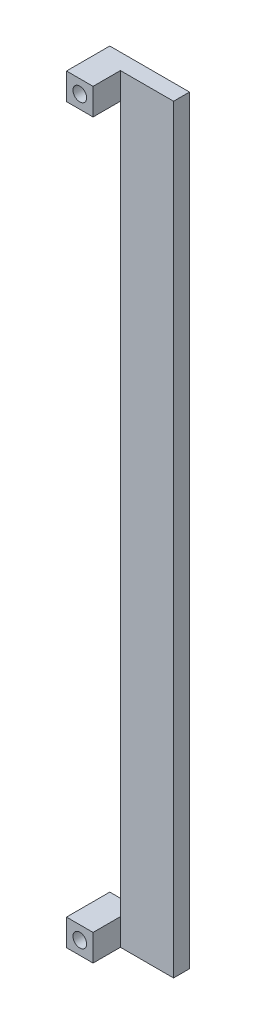
ISO-10303-21;
HEADER;
FILE_DESCRIPTION(('STEP AP214'),'2;1');
FILE_NAME('part.step','',(''),(''),'','','');
FILE_SCHEMA(('AUTOMOTIVE_DESIGN { 1 0 10303 214 1 1 1 1 }'));
ENDSEC;
DATA;
#1=APPLICATION_CONTEXT('core data for automotive mechanical design processes');
#2=APPLICATION_PROTOCOL_DEFINITION('international standard','automotive_design',2000,#1);
#3=PRODUCT_CONTEXT('',#1,'mechanical');
#4=PRODUCT('Part','Part','',(#3));
#5=PRODUCT_RELATED_PRODUCT_CATEGORY('part','',(#4));
#6=PRODUCT_DEFINITION_FORMATION('','',#4);
#7=PRODUCT_DEFINITION_CONTEXT('part definition',#1,'design');
#8=PRODUCT_DEFINITION('design','',#6,#7);
#9=PRODUCT_DEFINITION_SHAPE('','',#8);
#10=(LENGTH_UNIT() NAMED_UNIT(*) SI_UNIT(.MILLI.,.METRE.));
#11=(NAMED_UNIT(*) PLANE_ANGLE_UNIT() SI_UNIT($,.RADIAN.));
#12=(NAMED_UNIT(*) SI_UNIT($,.STERADIAN.) SOLID_ANGLE_UNIT());
#13=UNCERTAINTY_MEASURE_WITH_UNIT(LENGTH_MEASURE(1.E-05),#10,'distance_accuracy_value','');
#14=(GEOMETRIC_REPRESENTATION_CONTEXT(3) GLOBAL_UNCERTAINTY_ASSIGNED_CONTEXT((#13)) GLOBAL_UNIT_ASSIGNED_CONTEXT((#10,
#11,#12)) REPRESENTATION_CONTEXT('',''));
#15=CARTESIAN_POINT('',(0.,0.,0.));
#16=DIRECTION('',(0.,0.,1.));
#17=DIRECTION('',(1.,0.,0.));
#18=AXIS2_PLACEMENT_3D('',#15,#16,#17);
#19=CARTESIAN_POINT('',(-6.70317924025839,-12.1275190553962,4.2));
#20=DIRECTION('',(1.,0.,0.));
#21=DIRECTION('',(0.,0.,-1.));
#22=AXIS2_PLACEMENT_3D('',#19,#20,#21);
#23=PLANE('',#22);
#24=DIRECTION('',(0.,0.,-1.));
#25=VECTOR('',#24,1.);
#26=CARTESIAN_POINT('',(-6.70317924025839,180.872480944604,11.4));
#27=LINE('',#26,#25);
#28=CARTESIAN_POINT('',(-6.70317924025839,180.872480944604,4.2));
#29=VERTEX_POINT('',#28);
#30=CARTESIAN_POINT('',(-6.70317924025839,180.872480944604,0.));
#31=VERTEX_POINT('',#30);
#32=EDGE_CURVE('E215',#29,#31,#27,.T.);
#33=ORIENTED_EDGE('',*,*,#32,.T.);
#34=DIRECTION('',(0.,-1.,0.));
#35=VECTOR('',#34,1.);
#36=CARTESIAN_POINT('',(-6.70317924025839,-12.1275190553962,0.));
#37=LINE('',#36,#35);
#38=CARTESIAN_POINT('',(-6.70317924025839,-5.12751905539625,0.));
#39=VERTEX_POINT('',#38);
#40=EDGE_CURVE('E176',#31,#39,#37,.T.);
#41=ORIENTED_EDGE('',*,*,#40,.T.);
#42=DIRECTION('',(0.,0.,-1.));
#43=VECTOR('',#42,1.);
#44=CARTESIAN_POINT('',(-6.70317924025839,-5.12751905539625,11.4));
#45=LINE('',#44,#43);
#46=CARTESIAN_POINT('',(-6.70317924025839,-5.12751905539625,4.2));
#47=VERTEX_POINT('',#46);
#48=EDGE_CURVE('E11',#47,#39,#45,.T.);
#49=ORIENTED_EDGE('',*,*,#48,.F.);
#50=DIRECTION('',(0.,-1.,0.));
#51=VECTOR('',#50,1.);
#52=CARTESIAN_POINT('',(-6.70317924025839,-12.1275190553962,4.2));
#53=LINE('',#52,#51);
#54=EDGE_CURVE('E49',#29,#47,#53,.T.);
#55=ORIENTED_EDGE('',*,*,#54,.F.);
#56=EDGE_LOOP('',(#33,#41,#49,#55));
#57=FACE_BOUND('',#56,.T.);
#58=ADVANCED_FACE('F33',(#57),#23,.F.);
#59=CARTESIAN_POINT('',(7.29682075974161,-12.1275190553962,4.2));
#60=DIRECTION('',(0.,1.,0.));
#61=DIRECTION('',(0.,0.,1.));
#62=AXIS2_PLACEMENT_3D('',#59,#60,#61);
#63=PLANE('',#62);
#64=DIRECTION('',(1.,0.,0.));
#65=VECTOR('',#64,1.);
#66=CARTESIAN_POINT('',(7.29682075974161,-12.1275190553962,0.));
#67=LINE('',#66,#65);
#68=CARTESIAN_POINT('',(-13.7031792402584,-12.1275190553962,0.));
#69=VERTEX_POINT('',#68);
#70=CARTESIAN_POINT('',(7.29682075974161,-12.1275190553962,0.));
#71=VERTEX_POINT('',#70);
#72=EDGE_CURVE('E187',#69,#71,#67,.T.);
#73=ORIENTED_EDGE('',*,*,#72,.T.);
#74=DIRECTION('',(0.,0.,-1.));
#75=VECTOR('',#74,1.);
#76=CARTESIAN_POINT('',(7.29682075974161,-12.1275190553962,4.2));
#77=LINE('',#76,#75);
#78=CARTESIAN_POINT('',(7.29682075974161,-12.1275190553962,4.2));
#79=VERTEX_POINT('',#78);
#80=EDGE_CURVE('E36',#79,#71,#77,.T.);
#81=ORIENTED_EDGE('',*,*,#80,.F.);
#82=DIRECTION('',(1.,0.,0.));
#83=VECTOR('',#82,1.);
#84=CARTESIAN_POINT('',(7.29682075974161,-12.1275190553962,4.2));
#85=LINE('',#84,#83);
#86=CARTESIAN_POINT('',(-6.70317924025839,-12.1275190553962,4.2));
#87=VERTEX_POINT('',#86);
#88=EDGE_CURVE('E178',#87,#79,#85,.T.);
#89=ORIENTED_EDGE('',*,*,#88,.F.);
#90=DIRECTION('',(0.,0.,-1.));
#91=VECTOR('',#90,1.);
#92=CARTESIAN_POINT('',(-6.70317924025839,-12.1275190553962,11.4));
#93=LINE('',#92,#91);
#94=CARTESIAN_POINT('',(-6.70317924025839,-12.1275190553962,11.4));
#95=VERTEX_POINT('',#94);
#96=EDGE_CURVE('E163',#95,#87,#93,.T.);
#97=ORIENTED_EDGE('',*,*,#96,.F.);
#98=DIRECTION('',(1.,0.,0.));
#99=VECTOR('',#98,1.);
#100=CARTESIAN_POINT('',(-6.70317924025839,-12.1275190553962,11.4));
#101=LINE('',#100,#99);
#102=CARTESIAN_POINT('',(-13.7031792402584,-12.1275190553962,11.4));
#103=VERTEX_POINT('',#102);
#104=EDGE_CURVE('E161',#103,#95,#101,.T.);
#105=ORIENTED_EDGE('',*,*,#104,.F.);
#106=DIRECTION('',(0.,0.,-1.));
#107=VECTOR('',#106,1.);
#108=CARTESIAN_POINT('',(-13.7031792402584,-12.1275190553962,11.4));
#109=LINE('',#108,#107);
#110=EDGE_CURVE('E169',#103,#69,#109,.T.);
#111=ORIENTED_EDGE('',*,*,#110,.T.);
#112=EDGE_LOOP('',(#73,#81,#89,#97,#105,#111));
#113=FACE_BOUND('',#112,.T.);
#114=ADVANCED_FACE('F228',(#113),#63,.F.);
#115=CARTESIAN_POINT('',(7.29682075974159,187.872480944604,4.2));
#116=DIRECTION('',(-1.,0.,0.));
#117=DIRECTION('',(0.,-1.,0.));
#118=AXIS2_PLACEMENT_3D('',#115,#116,#117);
#119=PLANE('',#118);
#120=DIRECTION('',(0.,1.,0.));
#121=VECTOR('',#120,1.);
#122=CARTESIAN_POINT('',(7.29682075974159,187.872480944604,0.));
#123=LINE('',#122,#121);
#124=CARTESIAN_POINT('',(7.29682075974159,187.872480944604,0.));
#125=VERTEX_POINT('',#124);
#126=EDGE_CURVE('E189',#71,#125,#123,.T.);
#127=ORIENTED_EDGE('',*,*,#126,.T.);
#128=DIRECTION('',(0.,0.,-1.));
#129=VECTOR('',#128,1.);
#130=CARTESIAN_POINT('',(7.29682075974159,187.872480944604,4.2));
#131=LINE('',#130,#129);
#132=CARTESIAN_POINT('',(7.29682075974159,187.872480944604,4.2));
#133=VERTEX_POINT('',#132);
#134=EDGE_CURVE('E185',#133,#125,#131,.T.);
#135=ORIENTED_EDGE('',*,*,#134,.F.);
#136=DIRECTION('',(0.,1.,0.));
#137=VECTOR('',#136,1.);
#138=CARTESIAN_POINT('',(7.29682075974159,187.872480944604,4.2));
#139=LINE('',#138,#137);
#140=EDGE_CURVE('E181',#79,#133,#139,.T.);
#141=ORIENTED_EDGE('',*,*,#140,.F.);
#142=ORIENTED_EDGE('',*,*,#80,.T.);
#143=EDGE_LOOP('',(#127,#135,#141,#142));
#144=FACE_BOUND('',#143,.T.);
#145=ADVANCED_FACE('F200',(#144),#119,.F.);
#146=CARTESIAN_POINT('',(-6.70317924025839,187.872480944604,4.2));
#147=DIRECTION('',(0.,-1.,0.));
#148=DIRECTION('',(0.,0.,-1.));
#149=AXIS2_PLACEMENT_3D('',#146,#147,#148);
#150=PLANE('',#149);
#151=DIRECTION('',(-1.,0.,0.));
#152=VECTOR('',#151,1.);
#153=CARTESIAN_POINT('',(-6.70317924025839,187.872480944604,0.));
#154=LINE('',#153,#152);
#155=CARTESIAN_POINT('',(-13.7031792402584,187.872480944604,0.));
#156=VERTEX_POINT('',#155);
#157=EDGE_CURVE('E191',#125,#156,#154,.T.);
#158=ORIENTED_EDGE('',*,*,#157,.T.);
#159=DIRECTION('',(0.,0.,-1.));
#160=VECTOR('',#159,1.);
#161=CARTESIAN_POINT('',(-13.7031792402584,187.872480944604,11.4));
#162=LINE('',#161,#160);
#163=CARTESIAN_POINT('',(-13.7031792402584,187.872480944604,11.4));
#164=VERTEX_POINT('',#163);
#165=EDGE_CURVE('E122',#164,#156,#162,.T.);
#166=ORIENTED_EDGE('',*,*,#165,.F.);
#167=DIRECTION('',(-1.,0.,0.));
#168=VECTOR('',#167,1.);
#169=CARTESIAN_POINT('',(-6.70317924025839,187.872480944604,11.4));
#170=LINE('',#169,#168);
#171=CARTESIAN_POINT('',(-6.70317924025839,187.872480944604,11.4));
#172=VERTEX_POINT('',#171);
#173=EDGE_CURVE('E115',#172,#164,#170,.T.);
#174=ORIENTED_EDGE('',*,*,#173,.F.);
#175=DIRECTION('',(0.,0.,-1.));
#176=VECTOR('',#175,1.);
#177=CARTESIAN_POINT('',(-6.70317924025839,187.872480944604,11.4));
#178=LINE('',#177,#176);
#179=CARTESIAN_POINT('',(-6.70317924025839,187.872480944604,4.2));
#180=VERTEX_POINT('',#179);
#181=EDGE_CURVE('E120',#172,#180,#178,.T.);
#182=ORIENTED_EDGE('',*,*,#181,.T.);
#183=DIRECTION('',(-1.,0.,0.));
#184=VECTOR('',#183,1.);
#185=CARTESIAN_POINT('',(-6.70317924025839,187.872480944604,4.2));
#186=LINE('',#185,#184);
#187=EDGE_CURVE('E183',#133,#180,#186,.T.);
#188=ORIENTED_EDGE('',*,*,#187,.F.);
#189=ORIENTED_EDGE('',*,*,#134,.T.);
#190=EDGE_LOOP('',(#158,#166,#174,#182,#188,#189));
#191=FACE_BOUND('',#190,.T.);
#192=ADVANCED_FACE('F117',(#191),#150,.F.);
#193=CARTESIAN_POINT('',(0.,0.,4.2));
#194=DIRECTION('',(0.,0.,-1.));
#195=DIRECTION('',(-1.,0.,0.));
#196=AXIS2_PLACEMENT_3D('',#193,#194,#195);
#197=PLANE('',#196);
#198=EDGE_CURVE('E140',#180,#29,#53,.T.);
#199=ORIENTED_EDGE('',*,*,#198,.T.);
#200=ORIENTED_EDGE('',*,*,#54,.T.);
#201=EDGE_CURVE('E179',#47,#87,#53,.T.);
#202=ORIENTED_EDGE('',*,*,#201,.T.);
#203=ORIENTED_EDGE('',*,*,#88,.T.);
#204=ORIENTED_EDGE('',*,*,#140,.T.);
#205=ORIENTED_EDGE('',*,*,#187,.T.);
#206=EDGE_LOOP('',(#199,#200,#202,#203,#204,#205));
#207=FACE_BOUND('',#206,.T.);
#208=ADVANCED_FACE('F239',(#207),#197,.F.);
#209=CARTESIAN_POINT('',(0.,0.,0.));
#210=DIRECTION('',(0.,0.,-1.));
#211=DIRECTION('',(-1.,0.,0.));
#212=AXIS2_PLACEMENT_3D('',#209,#210,#211);
#213=PLANE('',#212);
#214=ORIENTED_EDGE('',*,*,#40,.F.);
#215=DIRECTION('',(1.,0.,0.));
#216=VECTOR('',#215,1.);
#217=CARTESIAN_POINT('',(-6.70317924025839,180.872480944604,0.));
#218=LINE('',#217,#216);
#219=CARTESIAN_POINT('',(-13.7031792402584,180.872480944604,0.));
#220=VERTEX_POINT('',#219);
#221=EDGE_CURVE('E136',#220,#31,#218,.T.);
#222=ORIENTED_EDGE('',*,*,#221,.F.);
#223=DIRECTION('',(0.,-1.,0.));
#224=VECTOR('',#223,1.);
#225=CARTESIAN_POINT('',(-13.7031792402584,187.872480944604,0.));
#226=LINE('',#225,#224);
#227=EDGE_CURVE('E209',#156,#220,#226,.T.);
#228=ORIENTED_EDGE('',*,*,#227,.F.);
#229=ORIENTED_EDGE('',*,*,#157,.F.);
#230=ORIENTED_EDGE('',*,*,#126,.F.);
#231=ORIENTED_EDGE('',*,*,#72,.F.);
#232=DIRECTION('',(0.,-1.,0.));
#233=VECTOR('',#232,1.);
#234=CARTESIAN_POINT('',(-13.7031792402584,-12.1275190553962,0.));
#235=LINE('',#234,#233);
#236=CARTESIAN_POINT('',(-13.7031792402584,-5.12751905539625,0.));
#237=VERTEX_POINT('',#236);
#238=EDGE_CURVE('E157',#237,#69,#235,.T.);
#239=ORIENTED_EDGE('',*,*,#238,.F.);
#240=DIRECTION('',(-1.,0.,0.));
#241=VECTOR('',#240,1.);
#242=CARTESIAN_POINT('',(-6.70317924025839,-5.12751905539625,0.));
#243=LINE('',#242,#241);
#244=EDGE_CURVE('E151',#39,#237,#243,.T.);
#245=ORIENTED_EDGE('',*,*,#244,.F.);
#246=EDGE_LOOP('',(#214,#222,#228,#229,#230,#231,#239,#245));
#247=FACE_BOUND('',#246,.T.);
#248=CARTESIAN_POINT('',(-10.2031792402584,-8.62751905539625,0.));
#249=DIRECTION('',(0.,0.,1.));
#250=DIRECTION('',(1.,0.,0.));
#251=AXIS2_PLACEMENT_3D('',#248,#249,#250);
#252=CIRCLE('',#251,1.8);
#253=CARTESIAN_POINT('',(-8.40317924025839,-8.62751905539625,0.));
#254=VERTEX_POINT('',#253);
#255=EDGE_CURVE('E141',#254,#254,#252,.T.);
#256=ORIENTED_EDGE('',*,*,#255,.T.);
#257=EDGE_LOOP('',(#256));
#258=FACE_BOUND('',#257,.T.);
#259=CARTESIAN_POINT('',(-10.2031792402584,184.372480944604,0.));
#260=DIRECTION('',(0.,0.,1.));
#261=DIRECTION('',(1.,0.,0.));
#262=AXIS2_PLACEMENT_3D('',#259,#260,#261);
#263=CIRCLE('',#262,1.8);
#264=CARTESIAN_POINT('',(-8.40317924025839,184.372480944604,0.));
#265=VERTEX_POINT('',#264);
#266=EDGE_CURVE('E282',#265,#265,#263,.T.);
#267=ORIENTED_EDGE('',*,*,#266,.T.);
#268=EDGE_LOOP('',(#267));
#269=FACE_BOUND('',#268,.T.);
#270=ADVANCED_FACE('F204',(#247,#258,#269),#213,.T.);
#271=CARTESIAN_POINT('',(0.,0.,11.4));
#272=DIRECTION('',(0.,0.,1.));
#273=DIRECTION('',(1.,0.,0.));
#274=AXIS2_PLACEMENT_3D('',#271,#272,#273);
#275=PLANE('',#274);
#276=DIRECTION('',(0.,1.,0.));
#277=VECTOR('',#276,1.);
#278=CARTESIAN_POINT('',(-6.70317924025839,-12.1275190553962,11.4));
#279=LINE('',#278,#277);
#280=CARTESIAN_POINT('',(-6.70317924025839,-5.12751905539625,11.4));
#281=VERTEX_POINT('',#280);
#282=EDGE_CURVE('E153',#95,#281,#279,.T.);
#283=ORIENTED_EDGE('',*,*,#282,.T.);
#284=DIRECTION('',(-1.,0.,0.));
#285=VECTOR('',#284,1.);
#286=CARTESIAN_POINT('',(-6.70317924025839,-5.12751905539625,11.4));
#287=LINE('',#286,#285);
#288=CARTESIAN_POINT('',(-13.7031792402584,-5.12751905539625,11.4));
#289=VERTEX_POINT('',#288);
#290=EDGE_CURVE('E156',#281,#289,#287,.T.);
#291=ORIENTED_EDGE('',*,*,#290,.T.);
#292=DIRECTION('',(0.,-1.,0.));
#293=VECTOR('',#292,1.);
#294=CARTESIAN_POINT('',(-13.7031792402584,-12.1275190553962,11.4));
#295=LINE('',#294,#293);
#296=EDGE_CURVE('E159',#289,#103,#295,.T.);
#297=ORIENTED_EDGE('',*,*,#296,.T.);
#298=ORIENTED_EDGE('',*,*,#104,.T.);
#299=EDGE_LOOP('',(#283,#291,#297,#298));
#300=FACE_BOUND('',#299,.T.);
#301=CARTESIAN_POINT('',(-10.2031792402584,-8.62751905539625,11.4));
#302=DIRECTION('',(0.,0.,1.));
#303=DIRECTION('',(1.,0.,0.));
#304=AXIS2_PLACEMENT_3D('',#301,#302,#303);
#305=CIRCLE('',#304,1.8);
#306=CARTESIAN_POINT('',(-8.40317924025839,-8.62751905539625,11.4));
#307=VERTEX_POINT('',#306);
#308=EDGE_CURVE('E144',#307,#307,#305,.T.);
#309=ORIENTED_EDGE('',*,*,#308,.F.);
#310=EDGE_LOOP('',(#309));
#311=FACE_BOUND('',#310,.T.);
#312=ADVANCED_FACE('F242',(#300,#311),#275,.T.);
#313=CARTESIAN_POINT('',(-6.70317924025839,-12.1275190553962,11.4));
#314=DIRECTION('',(-1.,0.,0.));
#315=DIRECTION('',(0.,0.,1.));
#316=AXIS2_PLACEMENT_3D('',#313,#314,#315);
#317=PLANE('',#316);
#318=ORIENTED_EDGE('',*,*,#201,.F.);
#319=EDGE_CURVE('E42',#281,#47,#45,.T.);
#320=ORIENTED_EDGE('',*,*,#319,.F.);
#321=ORIENTED_EDGE('',*,*,#282,.F.);
#322=ORIENTED_EDGE('',*,*,#96,.T.);
#323=EDGE_LOOP('',(#318,#320,#321,#322));
#324=FACE_BOUND('',#323,.T.);
#325=ADVANCED_FACE('F245',(#324),#317,.F.);
#326=CARTESIAN_POINT('',(-6.70317924025839,-5.12751905539625,11.4));
#327=DIRECTION('',(0.,-1.,0.));
#328=DIRECTION('',(1.,0.,0.));
#329=AXIS2_PLACEMENT_3D('',#326,#327,#328);
#330=PLANE('',#329);
#331=ORIENTED_EDGE('',*,*,#244,.T.);
#332=DIRECTION('',(0.,0.,-1.));
#333=VECTOR('',#332,1.);
#334=CARTESIAN_POINT('',(-13.7031792402584,-5.12751905539625,11.4));
#335=LINE('',#334,#333);
#336=EDGE_CURVE('E172',#289,#237,#335,.T.);
#337=ORIENTED_EDGE('',*,*,#336,.F.);
#338=ORIENTED_EDGE('',*,*,#290,.F.);
#339=ORIENTED_EDGE('',*,*,#319,.T.);
#340=ORIENTED_EDGE('',*,*,#48,.T.);
#341=EDGE_LOOP('',(#331,#337,#338,#339,#340));
#342=FACE_BOUND('',#341,.T.);
#343=ADVANCED_FACE('F248',(#342),#330,.F.);
#344=CARTESIAN_POINT('',(-13.7031792402584,-12.1275190553962,11.4));
#345=DIRECTION('',(1.,0.,0.));
#346=DIRECTION('',(0.,0.,-1.));
#347=AXIS2_PLACEMENT_3D('',#344,#345,#346);
#348=PLANE('',#347);
#349=ORIENTED_EDGE('',*,*,#238,.T.);
#350=ORIENTED_EDGE('',*,*,#110,.F.);
#351=ORIENTED_EDGE('',*,*,#296,.F.);
#352=ORIENTED_EDGE('',*,*,#336,.T.);
#353=EDGE_LOOP('',(#349,#350,#351,#352));
#354=FACE_BOUND('',#353,.T.);
#355=ADVANCED_FACE('F252',(#354),#348,.F.);
#356=CARTESIAN_POINT('',(-10.2031792402584,-8.62751905539625,11.4));
#357=DIRECTION('',(0.,0.,-1.));
#358=DIRECTION('',(-1.,0.,0.));
#359=AXIS2_PLACEMENT_3D('',#356,#357,#358);
#360=CYLINDRICAL_SURFACE('',#359,1.8);
#361=ORIENTED_EDGE('',*,*,#308,.T.);
#362=EDGE_LOOP('',(#361));
#363=FACE_BOUND('',#362,.T.);
#364=ORIENTED_EDGE('',*,*,#255,.F.);
#365=EDGE_LOOP('',(#364));
#366=FACE_BOUND('',#365,.T.);
#367=ADVANCED_FACE('F256',(#363,#366),#360,.F.);
#368=CARTESIAN_POINT('',(-6.70317924025839,187.872480944604,11.4));
#369=DIRECTION('',(-1.,0.,0.));
#370=DIRECTION('',(0.,-1.,0.));
#371=AXIS2_PLACEMENT_3D('',#368,#369,#370);
#372=PLANE('',#371);
#373=CARTESIAN_POINT('',(-6.70317924025839,180.872480944604,11.4));
#374=VERTEX_POINT('',#373);
#375=EDGE_CURVE('E222',#374,#29,#27,.T.);
#376=ORIENTED_EDGE('',*,*,#375,.T.);
#377=ORIENTED_EDGE('',*,*,#198,.F.);
#378=ORIENTED_EDGE('',*,*,#181,.F.);
#379=DIRECTION('',(0.,1.,0.));
#380=VECTOR('',#379,1.);
#381=CARTESIAN_POINT('',(-6.70317924025839,187.872480944604,11.4));
#382=LINE('',#381,#380);
#383=EDGE_CURVE('E126',#374,#172,#382,.T.);
#384=ORIENTED_EDGE('',*,*,#383,.F.);
#385=EDGE_LOOP('',(#376,#377,#378,#384));
#386=FACE_BOUND('',#385,.T.);
#387=ADVANCED_FACE('F139',(#386),#372,.F.);
#388=CARTESIAN_POINT('',(0.,0.,11.4));
#389=DIRECTION('',(0.,0.,-1.));
#390=DIRECTION('',(-1.,0.,0.));
#391=AXIS2_PLACEMENT_3D('',#388,#389,#390);
#392=PLANE('',#391);
#393=ORIENTED_EDGE('',*,*,#383,.T.);
#394=ORIENTED_EDGE('',*,*,#173,.T.);
#395=DIRECTION('',(0.,-1.,0.));
#396=VECTOR('',#395,1.);
#397=CARTESIAN_POINT('',(-13.7031792402584,187.872480944604,11.4));
#398=LINE('',#397,#396);
#399=CARTESIAN_POINT('',(-13.7031792402584,180.872480944604,11.4));
#400=VERTEX_POINT('',#399);
#401=EDGE_CURVE('E125',#164,#400,#398,.T.);
#402=ORIENTED_EDGE('',*,*,#401,.T.);
#403=DIRECTION('',(1.,0.,0.));
#404=VECTOR('',#403,1.);
#405=CARTESIAN_POINT('',(-6.70317924025839,180.872480944604,11.4));
#406=LINE('',#405,#404);
#407=EDGE_CURVE('E132',#400,#374,#406,.T.);
#408=ORIENTED_EDGE('',*,*,#407,.T.);
#409=EDGE_LOOP('',(#393,#394,#402,#408));
#410=FACE_BOUND('',#409,.T.);
#411=CARTESIAN_POINT('',(-10.2031792402584,184.372480944604,11.4));
#412=DIRECTION('',(0.,0.,1.));
#413=DIRECTION('',(1.,0.,0.));
#414=AXIS2_PLACEMENT_3D('',#411,#412,#413);
#415=CIRCLE('',#414,1.8);
#416=CARTESIAN_POINT('',(-8.40317924025839,184.372480944604,11.4));
#417=VERTEX_POINT('',#416);
#418=EDGE_CURVE('E219',#417,#417,#415,.T.);
#419=ORIENTED_EDGE('',*,*,#418,.F.);
#420=EDGE_LOOP('',(#419));
#421=FACE_BOUND('',#420,.T.);
#422=ADVANCED_FACE('F129',(#410,#421),#392,.F.);
#423=CARTESIAN_POINT('',(-13.7031792402584,187.872480944604,11.4));
#424=DIRECTION('',(1.,0.,0.));
#425=DIRECTION('',(0.,0.,-1.));
#426=AXIS2_PLACEMENT_3D('',#423,#424,#425);
#427=PLANE('',#426);
#428=ORIENTED_EDGE('',*,*,#227,.T.);
#429=DIRECTION('',(0.,0.,-1.));
#430=VECTOR('',#429,1.);
#431=CARTESIAN_POINT('',(-13.7031792402584,180.872480944604,11.4));
#432=LINE('',#431,#430);
#433=EDGE_CURVE('E146',#400,#220,#432,.T.);
#434=ORIENTED_EDGE('',*,*,#433,.F.);
#435=ORIENTED_EDGE('',*,*,#401,.F.);
#436=ORIENTED_EDGE('',*,*,#165,.T.);
#437=EDGE_LOOP('',(#428,#434,#435,#436));
#438=FACE_BOUND('',#437,.T.);
#439=ADVANCED_FACE('F211',(#438),#427,.F.);
#440=CARTESIAN_POINT('',(-6.70317924025839,180.872480944604,11.4));
#441=DIRECTION('',(0.,1.,0.));
#442=DIRECTION('',(0.,0.,1.));
#443=AXIS2_PLACEMENT_3D('',#440,#441,#442);
#444=PLANE('',#443);
#445=ORIENTED_EDGE('',*,*,#221,.T.);
#446=ORIENTED_EDGE('',*,*,#32,.F.);
#447=ORIENTED_EDGE('',*,*,#375,.F.);
#448=ORIENTED_EDGE('',*,*,#407,.F.);
#449=ORIENTED_EDGE('',*,*,#433,.T.);
#450=EDGE_LOOP('',(#445,#446,#447,#448,#449));
#451=FACE_BOUND('',#450,.T.);
#452=ADVANCED_FACE('F224',(#451),#444,.F.);
#453=CARTESIAN_POINT('',(-10.2031792402584,184.372480944604,11.4));
#454=DIRECTION('',(0.,0.,-1.));
#455=DIRECTION('',(-1.,0.,0.));
#456=AXIS2_PLACEMENT_3D('',#453,#454,#455);
#457=CYLINDRICAL_SURFACE('',#456,1.8);
#458=ORIENTED_EDGE('',*,*,#418,.T.);
#459=EDGE_LOOP('',(#458));
#460=FACE_BOUND('',#459,.T.);
#461=ORIENTED_EDGE('',*,*,#266,.F.);
#462=EDGE_LOOP('',(#461));
#463=FACE_BOUND('',#462,.T.);
#464=ADVANCED_FACE('F270',(#460,#463),#457,.F.);
#465=CLOSED_SHELL('',(#58,#114,#145,#192,#208,#270,#312,#325,#343,#355,#367,#387,#422,#439,#452,#464));
#466=MANIFOLD_SOLID_BREP('B2',#465);
#467=ADVANCED_BREP_SHAPE_REPRESENTATION('',(#18,#466),#14);
#468=SHAPE_DEFINITION_REPRESENTATION(#9,#467);
ENDSEC;
END-ISO-10303-21;
